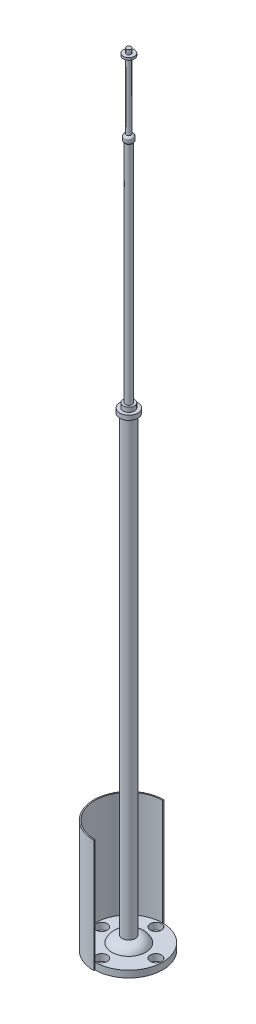
ISO-10303-21;
HEADER;
FILE_DESCRIPTION(('STEP AP214'),'2;1');
FILE_NAME('part.step','',(''),(''),'','','');
FILE_SCHEMA(('AUTOMOTIVE_DESIGN { 1 0 10303 214 1 1 1 1 }'));
ENDSEC;
DATA;
#1=APPLICATION_CONTEXT('core data for automotive mechanical design processes');
#2=APPLICATION_PROTOCOL_DEFINITION('international standard','automotive_design',2000,#1);
#3=PRODUCT_CONTEXT('',#1,'mechanical');
#4=PRODUCT('Part','Part','',(#3));
#5=PRODUCT_RELATED_PRODUCT_CATEGORY('part','',(#4));
#6=PRODUCT_DEFINITION_FORMATION('','',#4);
#7=PRODUCT_DEFINITION_CONTEXT('part definition',#1,'design');
#8=PRODUCT_DEFINITION('design','',#6,#7);
#9=PRODUCT_DEFINITION_SHAPE('','',#8);
#10=(LENGTH_UNIT() NAMED_UNIT(*) SI_UNIT(.MILLI.,.METRE.));
#11=(NAMED_UNIT(*) PLANE_ANGLE_UNIT() SI_UNIT($,.RADIAN.));
#12=(NAMED_UNIT(*) SI_UNIT($,.STERADIAN.) SOLID_ANGLE_UNIT());
#13=UNCERTAINTY_MEASURE_WITH_UNIT(LENGTH_MEASURE(1.E-05),#10,'distance_accuracy_value','');
#14=(GEOMETRIC_REPRESENTATION_CONTEXT(3) GLOBAL_UNCERTAINTY_ASSIGNED_CONTEXT((#13)) GLOBAL_UNIT_ASSIGNED_CONTEXT((#10,
#11,#12)) REPRESENTATION_CONTEXT('',''));
#15=CARTESIAN_POINT('',(0.,0.,0.));
#16=DIRECTION('',(0.,0.,1.));
#17=DIRECTION('',(1.,0.,0.));
#18=AXIS2_PLACEMENT_3D('',#15,#16,#17);
#19=CARTESIAN_POINT('',(0.,3.,0.));
#20=DIRECTION('',(0.,-1.,0.));
#21=DIRECTION('',(0.,0.,-1.));
#22=AXIS2_PLACEMENT_3D('',#19,#20,#21);
#23=CYLINDRICAL_SURFACE('',#22,15.);
#24=DIRECTION('',(0.,-1.,0.));
#25=VECTOR('',#24,1.);
#26=CARTESIAN_POINT('',(0.,50.,15.));
#27=LINE('',#26,#25);
#28=CARTESIAN_POINT('',(0.,3.,15.));
#29=VERTEX_POINT('',#28);
#30=CARTESIAN_POINT('',(0.,0.,15.));
#31=VERTEX_POINT('',#30);
#32=EDGE_CURVE('E121',#29,#31,#27,.T.);
#33=ORIENTED_EDGE('',*,*,#32,.T.);
#34=CARTESIAN_POINT('',(0.,0.,0.));
#35=DIRECTION('',(0.,1.,0.));
#36=DIRECTION('',(0.,0.,1.));
#37=AXIS2_PLACEMENT_3D('',#34,#35,#36);
#38=CIRCLE('',#37,15.);
#39=CARTESIAN_POINT('',(0.,0.,-15.));
#40=VERTEX_POINT('',#39);
#41=EDGE_CURVE('E169',#31,#40,#38,.T.);
#42=ORIENTED_EDGE('',*,*,#41,.T.);
#43=DIRECTION('',(0.,-1.,0.));
#44=VECTOR('',#43,1.);
#45=CARTESIAN_POINT('',(0.,50.,-15.));
#46=LINE('',#45,#44);
#47=CARTESIAN_POINT('',(0.,3.,-15.));
#48=VERTEX_POINT('',#47);
#49=EDGE_CURVE('E52',#48,#40,#46,.T.);
#50=ORIENTED_EDGE('',*,*,#49,.F.);
#51=CARTESIAN_POINT('',(0.,3.,0.));
#52=DIRECTION('',(0.,1.,0.));
#53=DIRECTION('',(0.,0.,1.));
#54=AXIS2_PLACEMENT_3D('',#51,#52,#53);
#55=CIRCLE('',#54,15.);
#56=EDGE_CURVE('E190',#29,#48,#55,.T.);
#57=ORIENTED_EDGE('',*,*,#56,.F.);
#58=EDGE_LOOP('',(#33,#42,#50,#57));
#59=FACE_BOUND('',#58,.T.);
#60=ADVANCED_FACE('F36',(#59),#23,.T.);
#61=CARTESIAN_POINT('',(0.,3.,0.));
#62=DIRECTION('',(0.,1.,0.));
#63=DIRECTION('',(0.,0.,1.));
#64=AXIS2_PLACEMENT_3D('',#61,#62,#63);
#65=PLANE('',#64);
#66=CARTESIAN_POINT('',(0.,3.,0.));
#67=DIRECTION('',(0.,1.,0.));
#68=DIRECTION('',(0.,0.,1.));
#69=AXIS2_PLACEMENT_3D('',#66,#67,#68);
#70=CIRCLE('',#69,7.5);
#71=CARTESIAN_POINT('',(0.,3.,7.5));
#72=VERTEX_POINT('',#71);
#73=EDGE_CURVE('E162',#72,#72,#70,.T.);
#74=ORIENTED_EDGE('',*,*,#73,.F.);
#75=EDGE_LOOP('',(#74));
#76=FACE_BOUND('',#75,.T.);
#77=CARTESIAN_POINT('',(0.,3.,-12.));
#78=DIRECTION('',(0.,1.,0.));
#79=DIRECTION('',(0.,0.,1.));
#80=AXIS2_PLACEMENT_3D('',#77,#78,#79);
#81=CIRCLE('',#80,2.5);
#82=CARTESIAN_POINT('',(0.,3.,-9.5));
#83=VERTEX_POINT('',#82);
#84=EDGE_CURVE('E170',#83,#83,#81,.T.);
#85=ORIENTED_EDGE('',*,*,#84,.F.);
#86=EDGE_LOOP('',(#85));
#87=FACE_BOUND('',#86,.T.);
#88=CARTESIAN_POINT('',(12.0000000000003,3.,-3.38856148926383E-13));
#89=DIRECTION('',(0.,1.,0.));
#90=DIRECTION('',(0.,0.,1.));
#91=AXIS2_PLACEMENT_3D('',#88,#89,#90);
#92=CIRCLE('',#91,2.50000000000027);
#93=CARTESIAN_POINT('',(12.0000000000003,3.,2.49999999999993));
#94=VERTEX_POINT('',#93);
#95=EDGE_CURVE('E176',#94,#94,#92,.T.);
#96=ORIENTED_EDGE('',*,*,#95,.F.);
#97=EDGE_LOOP('',(#96));
#98=FACE_BOUND('',#97,.T.);
#99=CARTESIAN_POINT('',(6.77712297852766E-13,3.,12.));
#100=DIRECTION('',(0.,1.,0.));
#101=DIRECTION('',(0.,0.,1.));
#102=AXIS2_PLACEMENT_3D('',#99,#100,#101);
#103=CIRCLE('',#102,2.50000000000073);
#104=CARTESIAN_POINT('',(6.77712297852766E-13,3.,14.5000000000007));
#105=VERTEX_POINT('',#104);
#106=EDGE_CURVE('E182',#105,#105,#103,.T.);
#107=ORIENTED_EDGE('',*,*,#106,.F.);
#108=EDGE_LOOP('',(#107));
#109=FACE_BOUND('',#108,.T.);
#110=CARTESIAN_POINT('',(-11.9999999999997,3.,3.4032572508536E-13));
#111=DIRECTION('',(0.,1.,0.));
#112=DIRECTION('',(0.,0.,1.));
#113=AXIS2_PLACEMENT_3D('',#110,#111,#112);
#114=CIRCLE('',#113,2.50000000000055);
#115=CARTESIAN_POINT('',(-11.9999999999997,3.,2.50000000000089));
#116=VERTEX_POINT('',#115);
#117=EDGE_CURVE('E165',#116,#116,#114,.T.);
#118=ORIENTED_EDGE('',*,*,#117,.F.);
#119=EDGE_LOOP('',(#118));
#120=FACE_BOUND('',#119,.T.);
#121=ORIENTED_EDGE('',*,*,#56,.T.);
#122=CARTESIAN_POINT('',(0.,3.,0.));
#123=DIRECTION('',(0.,1.,0.));
#124=DIRECTION('',(0.,0.,1.));
#125=AXIS2_PLACEMENT_3D('',#122,#123,#124);
#126=CIRCLE('',#125,15.);
#127=EDGE_CURVE('E58',#48,#29,#126,.T.);
#128=ORIENTED_EDGE('',*,*,#127,.T.);
#129=EDGE_LOOP('',(#121,#128));
#130=FACE_BOUND('',#129,.T.);
#131=ADVANCED_FACE('F219',(#76,#87,#98,#109,#120,#130),#65,.T.);
#132=CARTESIAN_POINT('',(0.,0.,0.));
#133=DIRECTION('',(0.,1.,0.));
#134=DIRECTION('',(0.,0.,1.));
#135=AXIS2_PLACEMENT_3D('',#132,#133,#134);
#136=PLANE('',#135);
#137=CARTESIAN_POINT('',(0.,0.,-12.));
#138=DIRECTION('',(0.,1.,0.));
#139=DIRECTION('',(0.,0.,1.));
#140=AXIS2_PLACEMENT_3D('',#137,#138,#139);
#141=CIRCLE('',#140,2.5);
#142=CARTESIAN_POINT('',(0.,0.,-9.5));
#143=VERTEX_POINT('',#142);
#144=EDGE_CURVE('E166',#143,#143,#141,.T.);
#145=ORIENTED_EDGE('',*,*,#144,.T.);
#146=EDGE_LOOP('',(#145));
#147=FACE_BOUND('',#146,.T.);
#148=CARTESIAN_POINT('',(12.0000000000003,0.,-3.38856148926383E-13));
#149=DIRECTION('',(0.,1.,0.));
#150=DIRECTION('',(0.,0.,1.));
#151=AXIS2_PLACEMENT_3D('',#148,#149,#150);
#152=CIRCLE('',#151,2.50000000000027);
#153=CARTESIAN_POINT('',(12.0000000000003,0.,2.49999999999993));
#154=VERTEX_POINT('',#153);
#155=EDGE_CURVE('E173',#154,#154,#152,.T.);
#156=ORIENTED_EDGE('',*,*,#155,.T.);
#157=EDGE_LOOP('',(#156));
#158=FACE_BOUND('',#157,.T.);
#159=CARTESIAN_POINT('',(6.77712297852766E-13,0.,12.));
#160=DIRECTION('',(0.,1.,0.));
#161=DIRECTION('',(0.,0.,1.));
#162=AXIS2_PLACEMENT_3D('',#159,#160,#161);
#163=CIRCLE('',#162,2.50000000000073);
#164=CARTESIAN_POINT('',(6.77712297852766E-13,0.,14.5000000000007));
#165=VERTEX_POINT('',#164);
#166=EDGE_CURVE('E179',#165,#165,#163,.T.);
#167=ORIENTED_EDGE('',*,*,#166,.T.);
#168=EDGE_LOOP('',(#167));
#169=FACE_BOUND('',#168,.T.);
#170=CARTESIAN_POINT('',(-11.9999999999997,0.,3.4032572508536E-13));
#171=DIRECTION('',(0.,1.,0.));
#172=DIRECTION('',(0.,0.,1.));
#173=AXIS2_PLACEMENT_3D('',#170,#171,#172);
#174=CIRCLE('',#173,2.50000000000055);
#175=CARTESIAN_POINT('',(-11.9999999999997,0.,2.50000000000089));
#176=VERTEX_POINT('',#175);
#177=EDGE_CURVE('E185',#176,#176,#174,.T.);
#178=ORIENTED_EDGE('',*,*,#177,.T.);
#179=EDGE_LOOP('',(#178));
#180=FACE_BOUND('',#179,.T.);
#181=ORIENTED_EDGE('',*,*,#41,.F.);
#182=DIRECTION('',(0.,0.,-1.));
#183=VECTOR('',#182,1.);
#184=CARTESIAN_POINT('',(0.,0.,0.));
#185=LINE('',#184,#183);
#186=CARTESIAN_POINT('',(0.,0.,15.5));
#187=VERTEX_POINT('',#186);
#188=EDGE_CURVE('E115',#187,#31,#185,.T.);
#189=ORIENTED_EDGE('',*,*,#188,.F.);
#190=CARTESIAN_POINT('',(0.,0.,0.));
#191=DIRECTION('',(0.,-1.,0.));
#192=DIRECTION('',(0.,0.,-1.));
#193=AXIS2_PLACEMENT_3D('',#190,#191,#192);
#194=CIRCLE('',#193,15.5);
#195=CARTESIAN_POINT('',(0.,0.,-15.5));
#196=VERTEX_POINT('',#195);
#197=EDGE_CURVE('E90',#187,#196,#194,.T.);
#198=ORIENTED_EDGE('',*,*,#197,.T.);
#199=DIRECTION('',(0.,0.,-1.));
#200=VECTOR('',#199,1.);
#201=CARTESIAN_POINT('',(0.,0.,0.));
#202=LINE('',#201,#200);
#203=EDGE_CURVE('E105',#40,#196,#202,.T.);
#204=ORIENTED_EDGE('',*,*,#203,.F.);
#205=EDGE_LOOP('',(#181,#189,#198,#204));
#206=FACE_BOUND('',#205,.T.);
#207=ADVANCED_FACE('F224',(#147,#158,#169,#180,#206),#136,.F.);
#208=CARTESIAN_POINT('',(-11.9999999999997,0.,3.4032572508536E-13));
#209=DIRECTION('',(0.,1.,0.));
#210=DIRECTION('',(0.,0.,1.));
#211=AXIS2_PLACEMENT_3D('',#208,#209,#210);
#212=CYLINDRICAL_SURFACE('',#211,2.50000000000055);
#213=ORIENTED_EDGE('',*,*,#177,.F.);
#214=EDGE_LOOP('',(#213));
#215=FACE_BOUND('',#214,.T.);
#216=ORIENTED_EDGE('',*,*,#117,.T.);
#217=EDGE_LOOP('',(#216));
#218=FACE_BOUND('',#217,.T.);
#219=ADVANCED_FACE('F265',(#215,#218),#212,.F.);
#220=CARTESIAN_POINT('',(6.77712297852766E-13,0.,12.));
#221=DIRECTION('',(0.,1.,0.));
#222=DIRECTION('',(0.,0.,1.));
#223=AXIS2_PLACEMENT_3D('',#220,#221,#222);
#224=CYLINDRICAL_SURFACE('',#223,2.50000000000073);
#225=ORIENTED_EDGE('',*,*,#166,.F.);
#226=EDGE_LOOP('',(#225));
#227=FACE_BOUND('',#226,.T.);
#228=ORIENTED_EDGE('',*,*,#106,.T.);
#229=EDGE_LOOP('',(#228));
#230=FACE_BOUND('',#229,.T.);
#231=ADVANCED_FACE('F270',(#227,#230),#224,.F.);
#232=CARTESIAN_POINT('',(12.0000000000003,0.,-3.38856148926383E-13));
#233=DIRECTION('',(0.,1.,0.));
#234=DIRECTION('',(0.,0.,1.));
#235=AXIS2_PLACEMENT_3D('',#232,#233,#234);
#236=CYLINDRICAL_SURFACE('',#235,2.50000000000027);
#237=ORIENTED_EDGE('',*,*,#155,.F.);
#238=EDGE_LOOP('',(#237));
#239=FACE_BOUND('',#238,.T.);
#240=ORIENTED_EDGE('',*,*,#95,.T.);
#241=EDGE_LOOP('',(#240));
#242=FACE_BOUND('',#241,.T.);
#243=ADVANCED_FACE('F242',(#239,#242),#236,.F.);
#244=CARTESIAN_POINT('',(0.,0.,-12.));
#245=DIRECTION('',(0.,1.,0.));
#246=DIRECTION('',(0.,0.,1.));
#247=AXIS2_PLACEMENT_3D('',#244,#245,#246);
#248=CYLINDRICAL_SURFACE('',#247,2.5);
#249=ORIENTED_EDGE('',*,*,#144,.F.);
#250=EDGE_LOOP('',(#249));
#251=FACE_BOUND('',#250,.T.);
#252=ORIENTED_EDGE('',*,*,#84,.T.);
#253=EDGE_LOOP('',(#252));
#254=FACE_BOUND('',#253,.T.);
#255=ADVANCED_FACE('F233',(#251,#254),#248,.F.);
#256=CARTESIAN_POINT('',(0.,1.,0.));
#257=DIRECTION('',(0.,-1.,0.));
#258=DIRECTION('',(0.,0.,-1.));
#259=AXIS2_PLACEMENT_3D('',#256,#257,#258);
#260=DEGENERATE_TOROIDAL_SURFACE('',#259,2.91742430504416,5.,.T.);
#261=ORIENTED_EDGE('',*,*,#73,.T.);
#262=EDGE_LOOP('',(#261));
#263=FACE_BOUND('',#262,.T.);
#264=CARTESIAN_POINT('',(0.,6.,0.));
#265=DIRECTION('',(0.,1.,0.));
#266=DIRECTION('',(0.,0.,1.));
#267=AXIS2_PLACEMENT_3D('',#264,#265,#266);
#268=CIRCLE('',#267,2.91742430504416);
#269=CARTESIAN_POINT('',(0.,6.,2.91742430504416));
#270=VERTEX_POINT('',#269);
#271=EDGE_CURVE('E153',#270,#270,#268,.T.);
#272=ORIENTED_EDGE('',*,*,#271,.F.);
#273=EDGE_LOOP('',(#272));
#274=FACE_BOUND('',#273,.T.);
#275=ADVANCED_FACE('F230',(#263,#274),#260,.T.);
#276=CARTESIAN_POINT('',(0.,206.,0.));
#277=DIRECTION('',(0.,-1.,0.));
#278=DIRECTION('',(0.,0.,-1.));
#279=AXIS2_PLACEMENT_3D('',#276,#277,#278);
#280=CYLINDRICAL_SURFACE('',#279,2.91742430504416);
#281=CARTESIAN_POINT('',(0.,206.,0.));
#282=DIRECTION('',(0.,1.,0.));
#283=DIRECTION('',(0.,0.,1.));
#284=AXIS2_PLACEMENT_3D('',#281,#282,#283);
#285=CIRCLE('',#284,2.91742430504416);
#286=CARTESIAN_POINT('',(0.,206.,2.91742430504416));
#287=VERTEX_POINT('',#286);
#288=EDGE_CURVE('E157',#287,#287,#285,.T.);
#289=ORIENTED_EDGE('',*,*,#288,.F.);
#290=EDGE_LOOP('',(#289));
#291=FACE_BOUND('',#290,.T.);
#292=ORIENTED_EDGE('',*,*,#271,.T.);
#293=EDGE_LOOP('',(#292));
#294=FACE_BOUND('',#293,.T.);
#295=ADVANCED_FACE('F232',(#291,#294),#280,.T.);
#296=CARTESIAN_POINT('',(0.,208.,0.));
#297=DIRECTION('',(0.,-1.,0.));
#298=DIRECTION('',(0.,0.,-1.));
#299=AXIS2_PLACEMENT_3D('',#296,#297,#298);
#300=CYLINDRICAL_SURFACE('',#299,4.);
#301=CARTESIAN_POINT('',(0.,208.,0.));
#302=DIRECTION('',(0.,1.,0.));
#303=DIRECTION('',(0.,0.,1.));
#304=AXIS2_PLACEMENT_3D('',#301,#302,#303);
#305=CIRCLE('',#304,4.);
#306=CARTESIAN_POINT('',(0.,208.,4.));
#307=VERTEX_POINT('',#306);
#308=EDGE_CURVE('E154',#307,#307,#305,.T.);
#309=ORIENTED_EDGE('',*,*,#308,.F.);
#310=EDGE_LOOP('',(#309));
#311=FACE_BOUND('',#310,.T.);
#312=CARTESIAN_POINT('',(0.,206.,0.));
#313=DIRECTION('',(0.,1.,0.));
#314=DIRECTION('',(0.,0.,1.));
#315=AXIS2_PLACEMENT_3D('',#312,#313,#314);
#316=CIRCLE('',#315,4.);
#317=CARTESIAN_POINT('',(0.,206.,4.));
#318=VERTEX_POINT('',#317);
#319=EDGE_CURVE('E150',#318,#318,#316,.T.);
#320=ORIENTED_EDGE('',*,*,#319,.T.);
#321=EDGE_LOOP('',(#320));
#322=FACE_BOUND('',#321,.T.);
#323=ADVANCED_FACE('F239',(#311,#322),#300,.T.);
#324=CARTESIAN_POINT('',(0.,208.,0.));
#325=DIRECTION('',(0.,1.,0.));
#326=DIRECTION('',(0.,0.,1.));
#327=AXIS2_PLACEMENT_3D('',#324,#325,#326);
#328=PLANE('',#327);
#329=CARTESIAN_POINT('',(0.,208.,0.));
#330=DIRECTION('',(0.,1.,0.));
#331=DIRECTION('',(0.,0.,1.));
#332=AXIS2_PLACEMENT_3D('',#329,#330,#331);
#333=CIRCLE('',#332,2.5);
#334=CARTESIAN_POINT('',(0.,208.,2.5));
#335=VERTEX_POINT('',#334);
#336=EDGE_CURVE('E147',#335,#335,#333,.T.);
#337=ORIENTED_EDGE('',*,*,#336,.F.);
#338=EDGE_LOOP('',(#337));
#339=FACE_BOUND('',#338,.T.);
#340=ORIENTED_EDGE('',*,*,#308,.T.);
#341=EDGE_LOOP('',(#340));
#342=FACE_BOUND('',#341,.T.);
#343=ADVANCED_FACE('F293',(#339,#342),#328,.T.);
#344=CARTESIAN_POINT('',(0.,206.,0.));
#345=DIRECTION('',(0.,1.,0.));
#346=DIRECTION('',(0.,0.,1.));
#347=AXIS2_PLACEMENT_3D('',#344,#345,#346);
#348=PLANE('',#347);
#349=ORIENTED_EDGE('',*,*,#288,.T.);
#350=EDGE_LOOP('',(#349));
#351=FACE_BOUND('',#350,.T.);
#352=ORIENTED_EDGE('',*,*,#319,.F.);
#353=EDGE_LOOP('',(#352));
#354=FACE_BOUND('',#353,.T.);
#355=ADVANCED_FACE('F295',(#351,#354),#348,.F.);
#356=CARTESIAN_POINT('',(0.,210.,0.));
#357=DIRECTION('',(0.,-1.,0.));
#358=DIRECTION('',(0.,0.,-1.));
#359=AXIS2_PLACEMENT_3D('',#356,#357,#358);
#360=CYLINDRICAL_SURFACE('',#359,2.5);
#361=CARTESIAN_POINT('',(0.,210.,0.));
#362=DIRECTION('',(0.,1.,0.));
#363=DIRECTION('',(0.,0.,1.));
#364=AXIS2_PLACEMENT_3D('',#361,#362,#363);
#365=CIRCLE('',#364,2.5);
#366=CARTESIAN_POINT('',(0.,210.,2.5));
#367=VERTEX_POINT('',#366);
#368=EDGE_CURVE('E142',#367,#367,#365,.T.);
#369=ORIENTED_EDGE('',*,*,#368,.F.);
#370=EDGE_LOOP('',(#369));
#371=FACE_BOUND('',#370,.T.);
#372=ORIENTED_EDGE('',*,*,#336,.T.);
#373=EDGE_LOOP('',(#372));
#374=FACE_BOUND('',#373,.T.);
#375=ADVANCED_FACE('F298',(#371,#374),#360,.T.);
#376=CARTESIAN_POINT('',(0.,210.,0.));
#377=DIRECTION('',(0.,1.,0.));
#378=DIRECTION('',(0.,0.,1.));
#379=AXIS2_PLACEMENT_3D('',#376,#377,#378);
#380=PLANE('',#379);
#381=CARTESIAN_POINT('',(0.,210.,0.));
#382=DIRECTION('',(0.,1.,0.));
#383=DIRECTION('',(0.,0.,1.));
#384=AXIS2_PLACEMENT_3D('',#381,#382,#383);
#385=CIRCLE('',#384,1.5);
#386=CARTESIAN_POINT('',(0.,210.,1.5));
#387=VERTEX_POINT('',#386);
#388=EDGE_CURVE('E143',#387,#387,#385,.T.);
#389=ORIENTED_EDGE('',*,*,#388,.F.);
#390=EDGE_LOOP('',(#389));
#391=FACE_BOUND('',#390,.T.);
#392=ORIENTED_EDGE('',*,*,#368,.T.);
#393=EDGE_LOOP('',(#392));
#394=FACE_BOUND('',#393,.T.);
#395=ADVANCED_FACE('F305',(#391,#394),#380,.T.);
#396=CARTESIAN_POINT('',(0.,310.,0.));
#397=DIRECTION('',(0.,-1.,0.));
#398=DIRECTION('',(0.,0.,-1.));
#399=AXIS2_PLACEMENT_3D('',#396,#397,#398);
#400=CYLINDRICAL_SURFACE('',#399,1.5);
#401=CARTESIAN_POINT('',(0.,310.,0.));
#402=DIRECTION('',(0.,1.,0.));
#403=DIRECTION('',(0.,0.,1.));
#404=AXIS2_PLACEMENT_3D('',#401,#402,#403);
#405=CIRCLE('',#404,1.5);
#406=CARTESIAN_POINT('',(0.,310.,1.5));
#407=VERTEX_POINT('',#406);
#408=EDGE_CURVE('E139',#407,#407,#405,.T.);
#409=ORIENTED_EDGE('',*,*,#408,.F.);
#410=EDGE_LOOP('',(#409));
#411=FACE_BOUND('',#410,.T.);
#412=ORIENTED_EDGE('',*,*,#388,.T.);
#413=EDGE_LOOP('',(#412));
#414=FACE_BOUND('',#413,.T.);
#415=ADVANCED_FACE('F309',(#411,#414),#400,.T.);
#416=CARTESIAN_POINT('',(0.,313.,0.));
#417=DIRECTION('',(0.,-1.,0.));
#418=DIRECTION('',(0.,0.,-1.));
#419=AXIS2_PLACEMENT_3D('',#416,#417,#418);
#420=CYLINDRICAL_SURFACE('',#419,2.);
#421=CARTESIAN_POINT('',(0.,310.866025403784,0.));
#422=DIRECTION('',(0.,-1.,0.));
#423=DIRECTION('',(0.,0.,-1.));
#424=AXIS2_PLACEMENT_3D('',#421,#422,#423);
#425=CIRCLE('',#424,2.);
#426=CARTESIAN_POINT('',(0.,310.866025403784,-2.));
#427=VERTEX_POINT('',#426);
#428=EDGE_CURVE('E196',#427,#427,#425,.F.);
#429=ORIENTED_EDGE('',*,*,#428,.T.);
#430=EDGE_LOOP('',(#429));
#431=FACE_BOUND('',#430,.T.);
#432=CARTESIAN_POINT('',(0.,312.,0.));
#433=DIRECTION('',(0.,1.,0.));
#434=DIRECTION('',(0.,0.,1.));
#435=AXIS2_PLACEMENT_3D('',#432,#433,#434);
#436=CIRCLE('',#435,2.);
#437=CARTESIAN_POINT('',(0.,312.,2.));
#438=VERTEX_POINT('',#437);
#439=EDGE_CURVE('E146',#438,#438,#436,.F.);
#440=ORIENTED_EDGE('',*,*,#439,.T.);
#441=EDGE_LOOP('',(#440));
#442=FACE_BOUND('',#441,.T.);
#443=ADVANCED_FACE('F215',(#431,#442),#420,.T.);
#444=CARTESIAN_POINT('',(0.,310.866025403784,0.));
#445=DIRECTION('',(0.,-1.,0.));
#446=DIRECTION('',(0.,0.,-1.));
#447=AXIS2_PLACEMENT_3D('',#444,#445,#446);
#448=DEGENERATE_TOROIDAL_SURFACE('',#447,1.,1.,.T.);
#449=ORIENTED_EDGE('',*,*,#408,.T.);
#450=EDGE_LOOP('',(#449));
#451=FACE_BOUND('',#450,.T.);
#452=ORIENTED_EDGE('',*,*,#428,.F.);
#453=EDGE_LOOP('',(#452));
#454=FACE_BOUND('',#453,.T.);
#455=ADVANCED_FACE('F206',(#451,#454),#448,.T.);
#456=CARTESIAN_POINT('',(0.,312.,0.));
#457=DIRECTION('',(0.,1.,0.));
#458=DIRECTION('',(0.,0.,1.));
#459=AXIS2_PLACEMENT_3D('',#456,#457,#458);
#460=DEGENERATE_TOROIDAL_SURFACE('',#459,1.,1.,.T.);
#461=ORIENTED_EDGE('',*,*,#439,.F.);
#462=EDGE_LOOP('',(#461));
#463=FACE_BOUND('',#462,.T.);
#464=CARTESIAN_POINT('',(0.,313.,0.));
#465=DIRECTION('',(0.,1.,0.));
#466=DIRECTION('',(0.,0.,1.));
#467=AXIS2_PLACEMENT_3D('',#464,#465,#466);
#468=CIRCLE('',#467,1.);
#469=CARTESIAN_POINT('',(0.,313.,1.));
#470=VERTEX_POINT('',#469);
#471=EDGE_CURVE('E40',#470,#470,#468,.T.);
#472=ORIENTED_EDGE('',*,*,#471,.F.);
#473=EDGE_LOOP('',(#472));
#474=FACE_BOUND('',#473,.T.);
#475=ADVANCED_FACE('F38',(#463,#474),#460,.T.);
#476=CARTESIAN_POINT('',(0.,343.,0.));
#477=DIRECTION('',(0.,-1.,0.));
#478=DIRECTION('',(0.,0.,-1.));
#479=AXIS2_PLACEMENT_3D('',#476,#477,#478);
#480=CYLINDRICAL_SURFACE('',#479,1.);
#481=CARTESIAN_POINT('',(0.,343.,0.));
#482=DIRECTION('',(0.,1.,0.));
#483=DIRECTION('',(0.,0.,1.));
#484=AXIS2_PLACEMENT_3D('',#481,#482,#483);
#485=CIRCLE('',#484,1.);
#486=CARTESIAN_POINT('',(0.,343.,1.));
#487=VERTEX_POINT('',#486);
#488=EDGE_CURVE('E134',#487,#487,#485,.T.);
#489=ORIENTED_EDGE('',*,*,#488,.F.);
#490=EDGE_LOOP('',(#489));
#491=FACE_BOUND('',#490,.T.);
#492=ORIENTED_EDGE('',*,*,#471,.T.);
#493=EDGE_LOOP('',(#492));
#494=FACE_BOUND('',#493,.T.);
#495=ADVANCED_FACE('F203',(#491,#494),#480,.T.);
#496=CARTESIAN_POINT('',(0.,344.,0.));
#497=DIRECTION('',(0.,-1.,0.));
#498=DIRECTION('',(0.,0.,-1.));
#499=AXIS2_PLACEMENT_3D('',#496,#497,#498);
#500=CYLINDRICAL_SURFACE('',#499,2.5);
#501=CARTESIAN_POINT('',(0.,344.,0.));
#502=DIRECTION('',(0.,1.,0.));
#503=DIRECTION('',(0.,0.,1.));
#504=AXIS2_PLACEMENT_3D('',#501,#502,#503);
#505=CIRCLE('',#504,2.5);
#506=CARTESIAN_POINT('',(0.,344.,2.5));
#507=VERTEX_POINT('',#506);
#508=EDGE_CURVE('E131',#507,#507,#505,.T.);
#509=ORIENTED_EDGE('',*,*,#508,.F.);
#510=EDGE_LOOP('',(#509));
#511=FACE_BOUND('',#510,.T.);
#512=CARTESIAN_POINT('',(0.,343.,0.));
#513=DIRECTION('',(0.,1.,0.));
#514=DIRECTION('',(0.,0.,1.));
#515=AXIS2_PLACEMENT_3D('',#512,#513,#514);
#516=CIRCLE('',#515,2.5);
#517=CARTESIAN_POINT('',(0.,343.,2.5));
#518=VERTEX_POINT('',#517);
#519=EDGE_CURVE('E129',#518,#518,#516,.T.);
#520=ORIENTED_EDGE('',*,*,#519,.T.);
#521=EDGE_LOOP('',(#520));
#522=FACE_BOUND('',#521,.T.);
#523=ADVANCED_FACE('F212',(#511,#522),#500,.T.);
#524=CARTESIAN_POINT('',(0.,344.,0.));
#525=DIRECTION('',(0.,1.,0.));
#526=DIRECTION('',(0.,0.,1.));
#527=AXIS2_PLACEMENT_3D('',#524,#525,#526);
#528=PLANE('',#527);
#529=CARTESIAN_POINT('',(0.,344.,0.));
#530=DIRECTION('',(0.,1.,0.));
#531=DIRECTION('',(0.,0.,1.));
#532=AXIS2_PLACEMENT_3D('',#529,#530,#531);
#533=CIRCLE('',#532,1.);
#534=CARTESIAN_POINT('',(0.,344.,1.));
#535=VERTEX_POINT('',#534);
#536=EDGE_CURVE('E11',#535,#535,#533,.T.);
#537=ORIENTED_EDGE('',*,*,#536,.F.);
#538=EDGE_LOOP('',(#537));
#539=FACE_BOUND('',#538,.T.);
#540=ORIENTED_EDGE('',*,*,#508,.T.);
#541=EDGE_LOOP('',(#540));
#542=FACE_BOUND('',#541,.T.);
#543=ADVANCED_FACE('F318',(#539,#542),#528,.T.);
#544=CARTESIAN_POINT('',(0.,343.,0.));
#545=DIRECTION('',(0.,1.,0.));
#546=DIRECTION('',(0.,0.,1.));
#547=AXIS2_PLACEMENT_3D('',#544,#545,#546);
#548=PLANE('',#547);
#549=ORIENTED_EDGE('',*,*,#488,.T.);
#550=EDGE_LOOP('',(#549));
#551=FACE_BOUND('',#550,.T.);
#552=ORIENTED_EDGE('',*,*,#519,.F.);
#553=EDGE_LOOP('',(#552));
#554=FACE_BOUND('',#553,.T.);
#555=ADVANCED_FACE('F320',(#551,#554),#548,.F.);
#556=CARTESIAN_POINT('',(0.,346.,0.));
#557=DIRECTION('',(0.,-1.,0.));
#558=DIRECTION('',(0.,0.,-1.));
#559=AXIS2_PLACEMENT_3D('',#556,#557,#558);
#560=CYLINDRICAL_SURFACE('',#559,1.);
#561=CARTESIAN_POINT('',(0.,346.,0.));
#562=DIRECTION('',(0.,1.,0.));
#563=DIRECTION('',(0.,0.,1.));
#564=AXIS2_PLACEMENT_3D('',#561,#562,#563);
#565=CIRCLE('',#564,1.);
#566=CARTESIAN_POINT('',(0.,346.,1.));
#567=VERTEX_POINT('',#566);
#568=EDGE_CURVE('E127',#567,#567,#565,.T.);
#569=ORIENTED_EDGE('',*,*,#568,.F.);
#570=EDGE_LOOP('',(#569));
#571=FACE_BOUND('',#570,.T.);
#572=ORIENTED_EDGE('',*,*,#536,.T.);
#573=EDGE_LOOP('',(#572));
#574=FACE_BOUND('',#573,.T.);
#575=ADVANCED_FACE('F323',(#571,#574),#560,.T.);
#576=CARTESIAN_POINT('',(0.,346.,0.));
#577=DIRECTION('',(0.,1.,0.));
#578=DIRECTION('',(0.,0.,1.));
#579=AXIS2_PLACEMENT_3D('',#576,#577,#578);
#580=PLANE('',#579);
#581=ORIENTED_EDGE('',*,*,#568,.T.);
#582=EDGE_LOOP('',(#581));
#583=FACE_BOUND('',#582,.T.);
#584=ADVANCED_FACE('F330',(#583),#580,.T.);
#585=CARTESIAN_POINT('',(0.,50.,0.));
#586=DIRECTION('',(-1.,0.,0.));
#587=DIRECTION('',(0.,0.,1.));
#588=AXIS2_PLACEMENT_3D('',#585,#586,#587);
#589=PLANE('',#588);
#590=ORIENTED_EDGE('',*,*,#188,.T.);
#591=ORIENTED_EDGE('',*,*,#32,.F.);
#592=CARTESIAN_POINT('',(0.,50.,15.));
#593=VERTEX_POINT('',#592);
#594=EDGE_CURVE('E103',#593,#29,#27,.T.);
#595=ORIENTED_EDGE('',*,*,#594,.F.);
#596=DIRECTION('',(0.,0.,-1.));
#597=VECTOR('',#596,1.);
#598=CARTESIAN_POINT('',(0.,50.,0.));
#599=LINE('',#598,#597);
#600=CARTESIAN_POINT('',(0.,50.,15.5));
#601=VERTEX_POINT('',#600);
#602=EDGE_CURVE('E99',#601,#593,#599,.T.);
#603=ORIENTED_EDGE('',*,*,#602,.F.);
#604=DIRECTION('',(0.,-1.,0.));
#605=VECTOR('',#604,1.);
#606=CARTESIAN_POINT('',(0.,50.,15.5));
#607=LINE('',#606,#605);
#608=EDGE_CURVE('E84',#601,#187,#607,.T.);
#609=ORIENTED_EDGE('',*,*,#608,.T.);
#610=EDGE_LOOP('',(#590,#591,#595,#603,#609));
#611=FACE_BOUND('',#610,.T.);
#612=ADVANCED_FACE('F100',(#611),#589,.F.);
#613=CARTESIAN_POINT('',(0.,50.,0.));
#614=DIRECTION('',(0.,-1.,0.));
#615=DIRECTION('',(0.,0.,-1.));
#616=AXIS2_PLACEMENT_3D('',#613,#614,#615);
#617=CYLINDRICAL_SURFACE('',#616,15.);
#618=ORIENTED_EDGE('',*,*,#127,.F.);
#619=CARTESIAN_POINT('',(0.,50.,-15.));
#620=VERTEX_POINT('',#619);
#621=EDGE_CURVE('E122',#620,#48,#46,.T.);
#622=ORIENTED_EDGE('',*,*,#621,.F.);
#623=CARTESIAN_POINT('',(0.,50.,0.));
#624=DIRECTION('',(0.,-1.,0.));
#625=DIRECTION('',(0.,0.,-1.));
#626=AXIS2_PLACEMENT_3D('',#623,#624,#625);
#627=CIRCLE('',#626,15.);
#628=EDGE_CURVE('E95',#593,#620,#627,.T.);
#629=ORIENTED_EDGE('',*,*,#628,.F.);
#630=ORIENTED_EDGE('',*,*,#594,.T.);
#631=EDGE_LOOP('',(#618,#622,#629,#630));
#632=FACE_BOUND('',#631,.T.);
#633=ADVANCED_FACE('F259',(#632),#617,.F.);
#634=CARTESIAN_POINT('',(0.,50.,0.));
#635=DIRECTION('',(-1.,0.,0.));
#636=DIRECTION('',(0.,0.,1.));
#637=AXIS2_PLACEMENT_3D('',#634,#635,#636);
#638=PLANE('',#637);
#639=ORIENTED_EDGE('',*,*,#203,.T.);
#640=DIRECTION('',(0.,-1.,0.));
#641=VECTOR('',#640,1.);
#642=CARTESIAN_POINT('',(0.,50.,-15.5));
#643=LINE('',#642,#641);
#644=CARTESIAN_POINT('',(0.,50.,-15.5));
#645=VERTEX_POINT('',#644);
#646=EDGE_CURVE('E94',#645,#196,#643,.T.);
#647=ORIENTED_EDGE('',*,*,#646,.F.);
#648=DIRECTION('',(0.,0.,-1.));
#649=VECTOR('',#648,1.);
#650=CARTESIAN_POINT('',(0.,50.,0.));
#651=LINE('',#650,#649);
#652=EDGE_CURVE('E109',#620,#645,#651,.T.);
#653=ORIENTED_EDGE('',*,*,#652,.F.);
#654=ORIENTED_EDGE('',*,*,#621,.T.);
#655=ORIENTED_EDGE('',*,*,#49,.T.);
#656=EDGE_LOOP('',(#639,#647,#653,#654,#655));
#657=FACE_BOUND('',#656,.T.);
#658=ADVANCED_FACE('F261',(#657),#638,.F.);
#659=CARTESIAN_POINT('',(0.,50.,0.));
#660=DIRECTION('',(0.,-1.,0.));
#661=DIRECTION('',(0.,0.,-1.));
#662=AXIS2_PLACEMENT_3D('',#659,#660,#661);
#663=CYLINDRICAL_SURFACE('',#662,15.5);
#664=ORIENTED_EDGE('',*,*,#197,.F.);
#665=ORIENTED_EDGE('',*,*,#608,.F.);
#666=CARTESIAN_POINT('',(0.,50.,0.));
#667=DIRECTION('',(0.,-1.,0.));
#668=DIRECTION('',(0.,0.,-1.));
#669=AXIS2_PLACEMENT_3D('',#666,#667,#668);
#670=CIRCLE('',#669,15.5);
#671=EDGE_CURVE('E88',#601,#645,#670,.T.);
#672=ORIENTED_EDGE('',*,*,#671,.T.);
#673=ORIENTED_EDGE('',*,*,#646,.T.);
#674=EDGE_LOOP('',(#664,#665,#672,#673));
#675=FACE_BOUND('',#674,.T.);
#676=ADVANCED_FACE('F86',(#675),#663,.T.);
#677=CARTESIAN_POINT('',(0.,50.,0.));
#678=DIRECTION('',(0.,-1.,0.));
#679=DIRECTION('',(0.,0.,-1.));
#680=AXIS2_PLACEMENT_3D('',#677,#678,#679);
#681=PLANE('',#680);
#682=ORIENTED_EDGE('',*,*,#602,.T.);
#683=ORIENTED_EDGE('',*,*,#628,.T.);
#684=ORIENTED_EDGE('',*,*,#652,.T.);
#685=ORIENTED_EDGE('',*,*,#671,.F.);
#686=EDGE_LOOP('',(#682,#683,#684,#685));
#687=FACE_BOUND('',#686,.T.);
#688=ADVANCED_FACE('F107',(#687),#681,.F.);
#689=CLOSED_SHELL('',(#60,#131,#207,#219,#231,#243,#255,#275,#295,#323,#343,#355,#375,#395,#415,
#443,#455,#475,#495,#523,#543,#555,#575,#584,#612,#633,#658,#676,#688));
#690=MANIFOLD_SOLID_BREP('B2',#689);
#691=ADVANCED_BREP_SHAPE_REPRESENTATION('',(#18,#690),#14);
#692=SHAPE_DEFINITION_REPRESENTATION(#9,#691);
ENDSEC;
END-ISO-10303-21;
